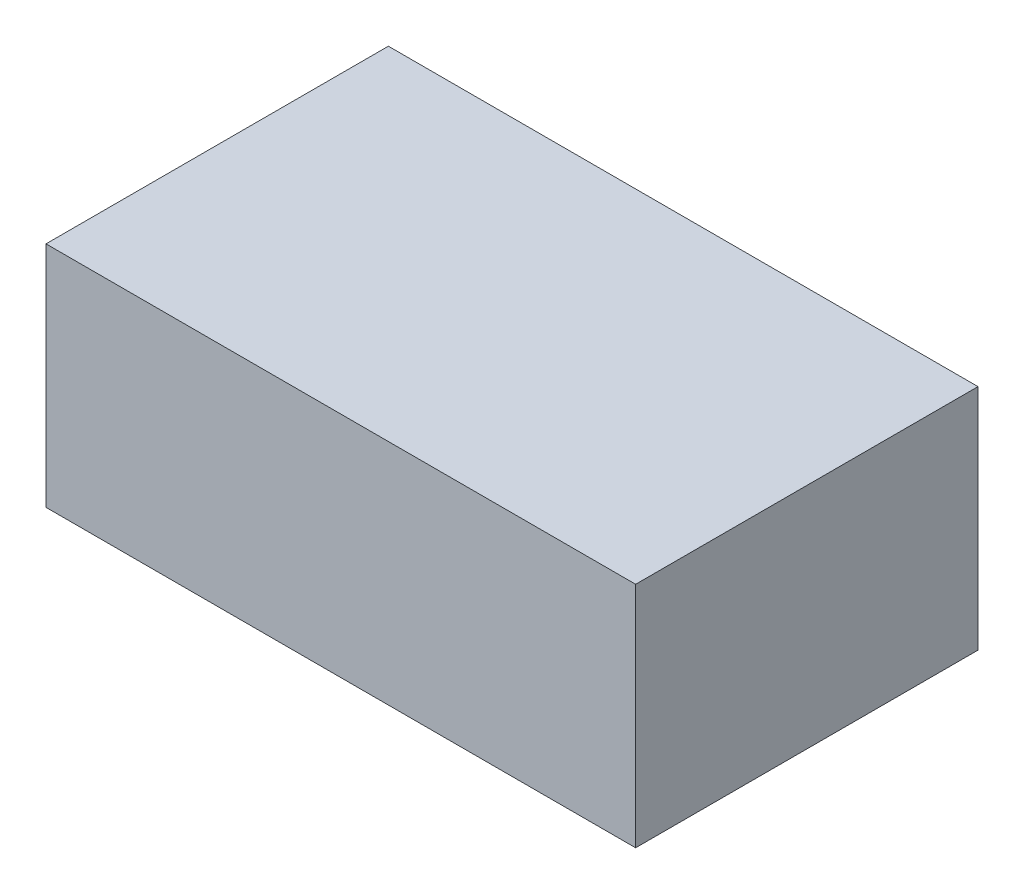
ISO-10303-21;
HEADER;
FILE_DESCRIPTION(('STEP AP214'),'2;1');
FILE_NAME('part.step','',(''),(''),'','','');
FILE_SCHEMA(('AUTOMOTIVE_DESIGN { 1 0 10303 214 1 1 1 1 }'));
ENDSEC;
DATA;
#1=APPLICATION_CONTEXT('core data for automotive mechanical design processes');
#2=APPLICATION_PROTOCOL_DEFINITION('international standard','automotive_design',2000,#1);
#3=PRODUCT_CONTEXT('',#1,'mechanical');
#4=PRODUCT('Part','Part','',(#3));
#5=PRODUCT_RELATED_PRODUCT_CATEGORY('part','',(#4));
#6=PRODUCT_DEFINITION_FORMATION('','',#4);
#7=PRODUCT_DEFINITION_CONTEXT('part definition',#1,'design');
#8=PRODUCT_DEFINITION('design','',#6,#7);
#9=PRODUCT_DEFINITION_SHAPE('','',#8);
#10=(LENGTH_UNIT() NAMED_UNIT(*) SI_UNIT(.MILLI.,.METRE.));
#11=(NAMED_UNIT(*) PLANE_ANGLE_UNIT() SI_UNIT($,.RADIAN.));
#12=(NAMED_UNIT(*) SI_UNIT($,.STERADIAN.) SOLID_ANGLE_UNIT());
#13=UNCERTAINTY_MEASURE_WITH_UNIT(LENGTH_MEASURE(1.E-05),#10,'distance_accuracy_value','');
#14=(GEOMETRIC_REPRESENTATION_CONTEXT(3) GLOBAL_UNCERTAINTY_ASSIGNED_CONTEXT((#13)) GLOBAL_UNIT_ASSIGNED_CONTEXT((#10,
#11,#12)) REPRESENTATION_CONTEXT('',''));
#15=CARTESIAN_POINT('',(0.,0.,0.));
#16=DIRECTION('',(0.,0.,1.));
#17=DIRECTION('',(1.,0.,0.));
#18=AXIS2_PLACEMENT_3D('',#15,#16,#17);
#19=CARTESIAN_POINT('',(-31.,-12.,18.));
#20=DIRECTION('',(0.,0.,1.));
#21=DIRECTION('',(1.,0.,0.));
#22=AXIS2_PLACEMENT_3D('',#19,#20,#21);
#23=PLANE('',#22);
#24=DIRECTION('',(0.,1.,0.));
#25=VECTOR('',#24,1.);
#26=CARTESIAN_POINT('',(-31.,-12.,18.));
#27=LINE('',#26,#25);
#28=CARTESIAN_POINT('',(-31.,-12.,18.));
#29=VERTEX_POINT('',#28);
#30=CARTESIAN_POINT('',(-31.,12.,18.));
#31=VERTEX_POINT('',#30);
#32=EDGE_CURVE('E88',#29,#31,#27,.T.);
#33=ORIENTED_EDGE('',*,*,#32,.F.);
#34=DIRECTION('',(1.,0.,0.));
#35=VECTOR('',#34,1.);
#36=CARTESIAN_POINT('',(-31.,-12.,18.));
#37=LINE('',#36,#35);
#38=CARTESIAN_POINT('',(31.,-12.,18.));
#39=VERTEX_POINT('',#38);
#40=EDGE_CURVE('E70',#29,#39,#37,.T.);
#41=ORIENTED_EDGE('',*,*,#40,.T.);
#42=DIRECTION('',(0.,1.,0.));
#43=VECTOR('',#42,1.);
#44=CARTESIAN_POINT('',(31.,-12.,18.));
#45=LINE('',#44,#43);
#46=CARTESIAN_POINT('',(31.,12.,18.));
#47=VERTEX_POINT('',#46);
#48=EDGE_CURVE('E82',#39,#47,#45,.T.);
#49=ORIENTED_EDGE('',*,*,#48,.T.);
#50=DIRECTION('',(1.,0.,0.));
#51=VECTOR('',#50,1.);
#52=CARTESIAN_POINT('',(-31.,12.,18.));
#53=LINE('',#52,#51);
#54=EDGE_CURVE('E10',#31,#47,#53,.T.);
#55=ORIENTED_EDGE('',*,*,#54,.F.);
#56=EDGE_LOOP('',(#33,#41,#49,#55));
#57=FACE_BOUND('',#56,.T.);
#58=ADVANCED_FACE('F16',(#57),#23,.T.);
#59=CARTESIAN_POINT('',(-31.,-12.,-18.));
#60=DIRECTION('',(0.,0.,1.));
#61=DIRECTION('',(1.,0.,0.));
#62=AXIS2_PLACEMENT_3D('',#59,#60,#61);
#63=PLANE('',#62);
#64=DIRECTION('',(1.,0.,0.));
#65=VECTOR('',#64,1.);
#66=CARTESIAN_POINT('',(-31.,12.,-18.));
#67=LINE('',#66,#65);
#68=CARTESIAN_POINT('',(-31.,12.,-18.));
#69=VERTEX_POINT('',#68);
#70=CARTESIAN_POINT('',(31.,12.,-18.));
#71=VERTEX_POINT('',#70);
#72=EDGE_CURVE('E25',#69,#71,#67,.T.);
#73=ORIENTED_EDGE('',*,*,#72,.T.);
#74=DIRECTION('',(0.,1.,0.));
#75=VECTOR('',#74,1.);
#76=CARTESIAN_POINT('',(31.,-12.,-18.));
#77=LINE('',#76,#75);
#78=CARTESIAN_POINT('',(31.,-12.,-18.));
#79=VERTEX_POINT('',#78);
#80=EDGE_CURVE('E103',#79,#71,#77,.T.);
#81=ORIENTED_EDGE('',*,*,#80,.F.);
#82=DIRECTION('',(1.,0.,0.));
#83=VECTOR('',#82,1.);
#84=CARTESIAN_POINT('',(-31.,-12.,-18.));
#85=LINE('',#84,#83);
#86=CARTESIAN_POINT('',(-31.,-12.,-18.));
#87=VERTEX_POINT('',#86);
#88=EDGE_CURVE('E81',#87,#79,#85,.T.);
#89=ORIENTED_EDGE('',*,*,#88,.F.);
#90=DIRECTION('',(0.,1.,0.));
#91=VECTOR('',#90,1.);
#92=CARTESIAN_POINT('',(-31.,-12.,-18.));
#93=LINE('',#92,#91);
#94=EDGE_CURVE('E89',#87,#69,#93,.T.);
#95=ORIENTED_EDGE('',*,*,#94,.T.);
#96=EDGE_LOOP('',(#73,#81,#89,#95));
#97=FACE_BOUND('',#96,.T.);
#98=ADVANCED_FACE('F18',(#97),#63,.F.);
#99=CARTESIAN_POINT('',(-31.,12.,-18.));
#100=DIRECTION('',(0.,1.,0.));
#101=DIRECTION('',(1.,0.,0.));
#102=AXIS2_PLACEMENT_3D('',#99,#100,#101);
#103=PLANE('',#102);
#104=ORIENTED_EDGE('',*,*,#72,.F.);
#105=DIRECTION('',(0.,0.,1.));
#106=VECTOR('',#105,1.);
#107=CARTESIAN_POINT('',(-31.,12.,-18.));
#108=LINE('',#107,#106);
#109=EDGE_CURVE('E93',#69,#31,#108,.T.);
#110=ORIENTED_EDGE('',*,*,#109,.T.);
#111=ORIENTED_EDGE('',*,*,#54,.T.);
#112=DIRECTION('',(0.,0.,1.));
#113=VECTOR('',#112,1.);
#114=CARTESIAN_POINT('',(31.,12.,-18.));
#115=LINE('',#114,#113);
#116=EDGE_CURVE('E106',#71,#47,#115,.T.);
#117=ORIENTED_EDGE('',*,*,#116,.F.);
#118=EDGE_LOOP('',(#104,#110,#111,#117));
#119=FACE_BOUND('',#118,.T.);
#120=ADVANCED_FACE('F142',(#119),#103,.T.);
#121=CARTESIAN_POINT('',(-31.,-12.,-18.));
#122=DIRECTION('',(0.,1.,0.));
#123=DIRECTION('',(1.,0.,0.));
#124=AXIS2_PLACEMENT_3D('',#121,#122,#123);
#125=PLANE('',#124);
#126=DIRECTION('',(0.,0.,1.));
#127=VECTOR('',#126,1.);
#128=CARTESIAN_POINT('',(31.,-12.,-18.));
#129=LINE('',#128,#127);
#130=EDGE_CURVE('E76',#79,#39,#129,.T.);
#131=ORIENTED_EDGE('',*,*,#130,.T.);
#132=ORIENTED_EDGE('',*,*,#40,.F.);
#133=DIRECTION('',(0.,0.,1.));
#134=VECTOR('',#133,1.);
#135=CARTESIAN_POINT('',(-31.,-12.,-18.));
#136=LINE('',#135,#134);
#137=EDGE_CURVE('E73',#87,#29,#136,.T.);
#138=ORIENTED_EDGE('',*,*,#137,.F.);
#139=ORIENTED_EDGE('',*,*,#88,.T.);
#140=EDGE_LOOP('',(#131,#132,#138,#139));
#141=FACE_BOUND('',#140,.T.);
#142=ADVANCED_FACE('F72',(#141),#125,.F.);
#143=CARTESIAN_POINT('',(31.,-12.,-18.));
#144=DIRECTION('',(1.,0.,0.));
#145=DIRECTION('',(0.,1.,0.));
#146=AXIS2_PLACEMENT_3D('',#143,#144,#145);
#147=PLANE('',#146);
#148=ORIENTED_EDGE('',*,*,#130,.F.);
#149=ORIENTED_EDGE('',*,*,#80,.T.);
#150=ORIENTED_EDGE('',*,*,#116,.T.);
#151=ORIENTED_EDGE('',*,*,#48,.F.);
#152=EDGE_LOOP('',(#148,#149,#150,#151));
#153=FACE_BOUND('',#152,.T.);
#154=ADVANCED_FACE('F125',(#153),#147,.T.);
#155=CARTESIAN_POINT('',(-31.,-12.,-18.));
#156=DIRECTION('',(1.,0.,0.));
#157=DIRECTION('',(0.,1.,0.));
#158=AXIS2_PLACEMENT_3D('',#155,#156,#157);
#159=PLANE('',#158);
#160=ORIENTED_EDGE('',*,*,#32,.T.);
#161=ORIENTED_EDGE('',*,*,#109,.F.);
#162=ORIENTED_EDGE('',*,*,#94,.F.);
#163=ORIENTED_EDGE('',*,*,#137,.T.);
#164=EDGE_LOOP('',(#160,#161,#162,#163));
#165=FACE_BOUND('',#164,.T.);
#166=ADVANCED_FACE('F86',(#165),#159,.F.);
#167=CLOSED_SHELL('',(#58,#98,#120,#142,#154,#166));
#168=MANIFOLD_SOLID_BREP('B1',#167);
#169=ADVANCED_BREP_SHAPE_REPRESENTATION('',(#18,#168),#14);
#170=SHAPE_DEFINITION_REPRESENTATION(#9,#169);
ENDSEC;
END-ISO-10303-21;
